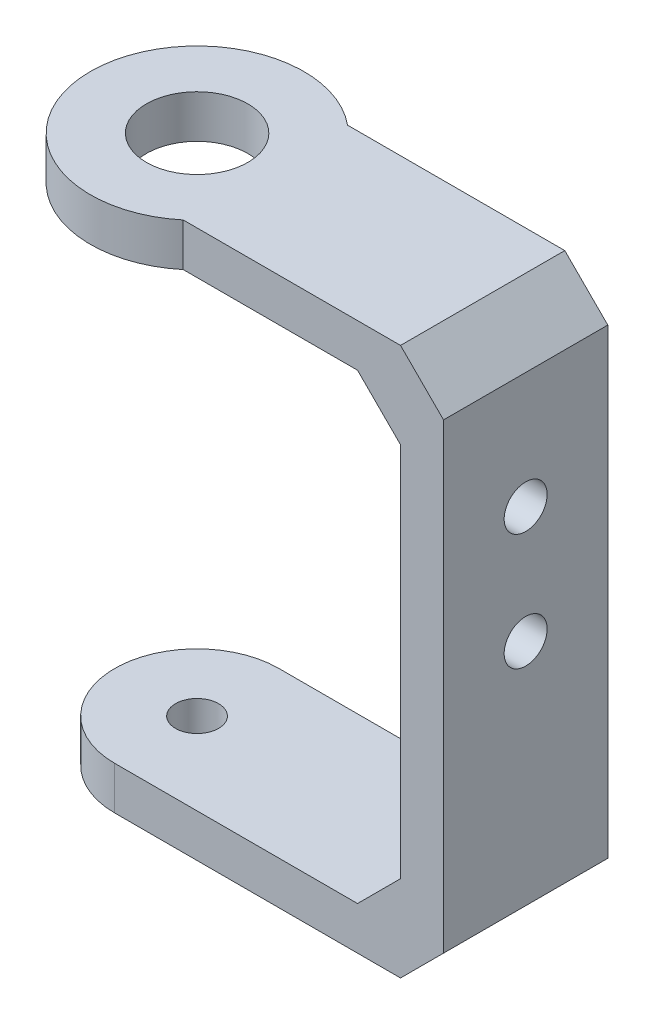
ISO-10303-21;
HEADER;
FILE_DESCRIPTION(('STEP AP214'),'2;1');
FILE_NAME('part.step','',(''),(''),'','','');
FILE_SCHEMA(('AUTOMOTIVE_DESIGN { 1 0 10303 214 1 1 1 1 }'));
ENDSEC;
DATA;
#1=APPLICATION_CONTEXT('core data for automotive mechanical design processes');
#2=APPLICATION_PROTOCOL_DEFINITION('international standard','automotive_design',2000,#1);
#3=PRODUCT_CONTEXT('',#1,'mechanical');
#4=PRODUCT('Part','Part','',(#3));
#5=PRODUCT_RELATED_PRODUCT_CATEGORY('part','',(#4));
#6=PRODUCT_DEFINITION_FORMATION('','',#4);
#7=PRODUCT_DEFINITION_CONTEXT('part definition',#1,'design');
#8=PRODUCT_DEFINITION('design','',#6,#7);
#9=PRODUCT_DEFINITION_SHAPE('','',#8);
#10=(LENGTH_UNIT() NAMED_UNIT(*) SI_UNIT(.MILLI.,.METRE.));
#11=(NAMED_UNIT(*) PLANE_ANGLE_UNIT() SI_UNIT($,.RADIAN.));
#12=(NAMED_UNIT(*) SI_UNIT($,.STERADIAN.) SOLID_ANGLE_UNIT());
#13=UNCERTAINTY_MEASURE_WITH_UNIT(LENGTH_MEASURE(1.E-05),#10,'distance_accuracy_value','');
#14=(GEOMETRIC_REPRESENTATION_CONTEXT(3) GLOBAL_UNCERTAINTY_ASSIGNED_CONTEXT((#13)) GLOBAL_UNIT_ASSIGNED_CONTEXT((#10,
#11,#12)) REPRESENTATION_CONTEXT('',''));
#15=CARTESIAN_POINT('',(0.,0.,0.));
#16=DIRECTION('',(0.,0.,1.));
#17=DIRECTION('',(1.,0.,0.));
#18=AXIS2_PLACEMENT_3D('',#15,#16,#17);
#19=CARTESIAN_POINT('',(23.7360999092236,38.9968362191147,-5.73));
#20=DIRECTION('',(0.70710700070138,0.707106561671647,0.));
#21=DIRECTION('',(-0.707106561671647,0.70710700070138,0.));
#22=AXIS2_PLACEMENT_3D('',#19,#20,#21);
#23=PLANE('',#22);
#24=DIRECTION('',(0.,0.,1.));
#25=VECTOR('',#24,1.);
#26=CARTESIAN_POINT('',(23.7360999092236,38.9968362191147,-5.73));
#27=LINE('',#26,#25);
#28=CARTESIAN_POINT('',(23.7360999092236,38.9968362191147,-5.73));
#29=VERTEX_POINT('',#28);
#30=CARTESIAN_POINT('',(23.7360999092236,38.9968362191147,5.73));
#31=VERTEX_POINT('',#30);
#32=EDGE_CURVE('E11',#29,#31,#27,.T.);
#33=ORIENTED_EDGE('',*,*,#32,.T.);
#34=DIRECTION('',(-0.707106561671647,0.70710700070138,0.));
#35=VECTOR('',#34,1.);
#36=CARTESIAN_POINT('',(23.7360999092236,38.9968362191147,5.73));
#37=LINE('',#36,#35);
#38=CARTESIAN_POINT('',(26.7361004009619,35.9968338647301,5.73));
#39=VERTEX_POINT('',#38);
#40=EDGE_CURVE('E202',#39,#31,#37,.T.);
#41=ORIENTED_EDGE('',*,*,#40,.F.);
#42=DIRECTION('',(0.,0.,1.));
#43=VECTOR('',#42,1.);
#44=CARTESIAN_POINT('',(26.7361004009619,35.9968338647301,-5.73));
#45=LINE('',#44,#43);
#46=CARTESIAN_POINT('',(26.7361004009619,35.9968338647301,-5.73));
#47=VERTEX_POINT('',#46);
#48=EDGE_CURVE('E42',#47,#39,#45,.T.);
#49=ORIENTED_EDGE('',*,*,#48,.F.);
#50=DIRECTION('',(-0.707106561671647,0.70710700070138,0.));
#51=VECTOR('',#50,1.);
#52=CARTESIAN_POINT('',(23.7360999092236,38.9968362191147,-5.73));
#53=LINE('',#52,#51);
#54=EDGE_CURVE('E49',#47,#29,#53,.T.);
#55=ORIENTED_EDGE('',*,*,#54,.T.);
#56=EDGE_LOOP('',(#33,#41,#49,#55));
#57=FACE_BOUND('',#56,.T.);
#58=ADVANCED_FACE('F33',(#57),#23,.T.);
#59=CARTESIAN_POINT('',(26.7361004009619,35.9968338647301,-5.73));
#60=DIRECTION('',(1.,0.,0.));
#61=DIRECTION('',(0.,1.,0.));
#62=AXIS2_PLACEMENT_3D('',#59,#60,#61);
#63=PLANE('',#62);
#64=CARTESIAN_POINT('',(26.7361004009619,27.8868338647301,0.));
#65=DIRECTION('',(1.,0.,0.));
#66=DIRECTION('',(0.,1.,0.));
#67=AXIS2_PLACEMENT_3D('',#64,#65,#66);
#68=CIRCLE('',#67,1.5);
#69=CARTESIAN_POINT('',(26.7361004009619,29.3868338647301,0.));
#70=VERTEX_POINT('',#69);
#71=EDGE_CURVE('E410',#70,#70,#68,.T.);
#72=ORIENTED_EDGE('',*,*,#71,.F.);
#73=EDGE_LOOP('',(#72));
#74=FACE_BOUND('',#73,.T.);
#75=CARTESIAN_POINT('',(26.7361004009619,19.7568357658201,0.));
#76=DIRECTION('',(1.,0.,0.));
#77=DIRECTION('',(0.,1.,0.));
#78=AXIS2_PLACEMENT_3D('',#75,#76,#77);
#79=CIRCLE('',#78,1.5);
#80=CARTESIAN_POINT('',(26.7361004009619,21.2568357658201,0.));
#81=VERTEX_POINT('',#80);
#82=EDGE_CURVE('E415',#81,#81,#79,.T.);
#83=ORIENTED_EDGE('',*,*,#82,.F.);
#84=EDGE_LOOP('',(#83));
#85=FACE_BOUND('',#84,.T.);
#86=ORIENTED_EDGE('',*,*,#48,.T.);
#87=DIRECTION('',(0.,1.,0.));
#88=VECTOR('',#87,1.);
#89=CARTESIAN_POINT('',(26.7361004009619,35.9968338647301,5.73));
#90=LINE('',#89,#88);
#91=CARTESIAN_POINT('',(26.7361004009619,3.77683532623596,5.73));
#92=VERTEX_POINT('',#91);
#93=EDGE_CURVE('E199',#92,#39,#90,.T.);
#94=ORIENTED_EDGE('',*,*,#93,.F.);
#95=DIRECTION('',(0.,0.,1.));
#96=VECTOR('',#95,1.);
#97=CARTESIAN_POINT('',(26.7361004009619,3.77683532623596,-5.73));
#98=LINE('',#97,#96);
#99=CARTESIAN_POINT('',(26.7361004009619,3.77683532623596,-5.73));
#100=VERTEX_POINT('',#99);
#101=EDGE_CURVE('E219',#100,#92,#98,.T.);
#102=ORIENTED_EDGE('',*,*,#101,.F.);
#103=DIRECTION('',(0.,1.,0.));
#104=VECTOR('',#103,1.);
#105=CARTESIAN_POINT('',(26.7361004009619,35.9968338647301,-5.73));
#106=LINE('',#105,#104);
#107=EDGE_CURVE('E215',#100,#47,#106,.T.);
#108=ORIENTED_EDGE('',*,*,#107,.T.);
#109=EDGE_LOOP('',(#86,#94,#102,#108));
#110=FACE_BOUND('',#109,.T.);
#111=ADVANCED_FACE('F258',(#74,#85,#110),#63,.T.);
#112=CARTESIAN_POINT('',(26.7361004009619,3.77683532623596,-5.73));
#113=DIRECTION('',(0.707106561671646,-0.707107000701381,0.));
#114=DIRECTION('',(0.707107000701381,0.707106561671646,0.));
#115=AXIS2_PLACEMENT_3D('',#112,#113,#114);
#116=PLANE('',#115);
#117=ORIENTED_EDGE('',*,*,#101,.T.);
#118=DIRECTION('',(0.707107000701381,0.707106561671646,0.));
#119=VECTOR('',#118,1.);
#120=CARTESIAN_POINT('',(26.7361004009619,3.77683532623596,5.73));
#121=LINE('',#120,#119);
#122=CARTESIAN_POINT('',(23.7360989779003,0.776835765820073,5.73));
#123=VERTEX_POINT('',#122);
#124=EDGE_CURVE('E196',#123,#92,#121,.T.);
#125=ORIENTED_EDGE('',*,*,#124,.F.);
#126=DIRECTION('',(0.,0.,1.));
#127=VECTOR('',#126,1.);
#128=CARTESIAN_POINT('',(23.7360989779003,0.776835765820073,-5.73));
#129=LINE('',#128,#127);
#130=CARTESIAN_POINT('',(23.7360989779003,0.776835765820073,-5.73));
#131=VERTEX_POINT('',#130);
#132=EDGE_CURVE('E221',#131,#123,#129,.T.);
#133=ORIENTED_EDGE('',*,*,#132,.F.);
#134=DIRECTION('',(0.707107000701381,0.707106561671646,0.));
#135=VECTOR('',#134,1.);
#136=CARTESIAN_POINT('',(26.7361004009619,3.77683532623596,-5.73));
#137=LINE('',#136,#135);
#138=EDGE_CURVE('E212',#131,#100,#137,.T.);
#139=ORIENTED_EDGE('',*,*,#138,.T.);
#140=EDGE_LOOP('',(#117,#125,#133,#139));
#141=FACE_BOUND('',#140,.T.);
#142=ADVANCED_FACE('F264',(#141),#116,.T.);
#143=CARTESIAN_POINT('',(20.7360984861625,3.77683812020412,-5.73));
#144=DIRECTION('',(-0.707106561671645,0.707107000701382,0.));
#145=DIRECTION('',(-0.707107000701382,-0.707106561671645,0.));
#146=AXIS2_PLACEMENT_3D('',#143,#144,#145);
#147=PLANE('',#146);
#148=DIRECTION('',(0.,0.,1.));
#149=VECTOR('',#148,1.);
#150=CARTESIAN_POINT('',(20.7360984861625,3.77683812020412,-5.73));
#151=LINE('',#150,#149);
#152=CARTESIAN_POINT('',(20.7360984861625,3.77683812020412,-5.73));
#153=VERTEX_POINT('',#152);
#154=CARTESIAN_POINT('',(20.7360984861625,3.77683812020412,5.73));
#155=VERTEX_POINT('',#154);
#156=EDGE_CURVE('E224',#153,#155,#151,.T.);
#157=ORIENTED_EDGE('',*,*,#156,.T.);
#158=DIRECTION('',(-0.707107000701382,-0.707106561671645,0.));
#159=VECTOR('',#158,1.);
#160=CARTESIAN_POINT('',(20.7360984861625,3.77683812020412,5.73));
#161=LINE('',#160,#159);
#162=CARTESIAN_POINT('',(23.7360989779009,6.77683674929729,5.73));
#163=VERTEX_POINT('',#162);
#164=EDGE_CURVE('E131',#163,#155,#161,.T.);
#165=ORIENTED_EDGE('',*,*,#164,.F.);
#166=DIRECTION('',(0.,0.,1.));
#167=VECTOR('',#166,1.);
#168=CARTESIAN_POINT('',(23.7360989779009,6.77683674929729,-5.73));
#169=LINE('',#168,#167);
#170=CARTESIAN_POINT('',(23.7360989779009,6.77683674929729,-5.73));
#171=VERTEX_POINT('',#170);
#172=EDGE_CURVE('E226',#171,#163,#169,.T.);
#173=ORIENTED_EDGE('',*,*,#172,.F.);
#174=DIRECTION('',(-0.707107000701382,-0.707106561671645,0.));
#175=VECTOR('',#174,1.);
#176=CARTESIAN_POINT('',(20.7360984861625,3.77683812020412,-5.73));
#177=LINE('',#176,#175);
#178=EDGE_CURVE('E210',#171,#153,#177,.T.);
#179=ORIENTED_EDGE('',*,*,#178,.T.);
#180=EDGE_LOOP('',(#157,#165,#173,#179));
#181=FACE_BOUND('',#180,.T.);
#182=ADVANCED_FACE('F255',(#181),#147,.T.);
#183=CARTESIAN_POINT('',(23.7360989779009,6.77683674929729,-5.73));
#184=DIRECTION('',(-1.,0.,0.));
#185=DIRECTION('',(0.,0.,1.));
#186=AXIS2_PLACEMENT_3D('',#183,#184,#185);
#187=PLANE('',#186);
#188=CARTESIAN_POINT('',(23.7360989779009,27.8868338647301,0.));
#189=DIRECTION('',(1.,0.,0.));
#190=DIRECTION('',(0.,1.,0.));
#191=AXIS2_PLACEMENT_3D('',#188,#189,#190);
#192=CIRCLE('',#191,1.5);
#193=CARTESIAN_POINT('',(23.7360989779009,29.3868338647301,0.));
#194=VERTEX_POINT('',#193);
#195=EDGE_CURVE('E407',#194,#194,#192,.T.);
#196=ORIENTED_EDGE('',*,*,#195,.T.);
#197=EDGE_LOOP('',(#196));
#198=FACE_BOUND('',#197,.T.);
#199=CARTESIAN_POINT('',(23.7360989779009,19.7568357658201,0.));
#200=DIRECTION('',(1.,0.,0.));
#201=DIRECTION('',(0.,1.,0.));
#202=AXIS2_PLACEMENT_3D('',#199,#200,#201);
#203=CIRCLE('',#202,1.5);
#204=CARTESIAN_POINT('',(23.7360989779009,21.2568357658201,0.));
#205=VERTEX_POINT('',#204);
#206=EDGE_CURVE('E411',#205,#205,#203,.T.);
#207=ORIENTED_EDGE('',*,*,#206,.T.);
#208=EDGE_LOOP('',(#207));
#209=FACE_BOUND('',#208,.T.);
#210=ORIENTED_EDGE('',*,*,#172,.T.);
#211=DIRECTION('',(0.,-1.,0.));
#212=VECTOR('',#211,1.);
#213=CARTESIAN_POINT('',(23.7360989779009,6.77683674929729,5.73));
#214=LINE('',#213,#212);
#215=CARTESIAN_POINT('',(23.7360989779009,32.9968380296051,5.73));
#216=VERTEX_POINT('',#215);
#217=EDGE_CURVE('E193',#216,#163,#214,.T.);
#218=ORIENTED_EDGE('',*,*,#217,.F.);
#219=DIRECTION('',(0.,0.,1.));
#220=VECTOR('',#219,1.);
#221=CARTESIAN_POINT('',(23.7360989779009,32.9968380296051,-5.73));
#222=LINE('',#221,#220);
#223=CARTESIAN_POINT('',(23.7360989779009,32.9968380296051,-5.73));
#224=VERTEX_POINT('',#223);
#225=EDGE_CURVE('E227',#224,#216,#222,.T.);
#226=ORIENTED_EDGE('',*,*,#225,.F.);
#227=DIRECTION('',(0.,-1.,0.));
#228=VECTOR('',#227,1.);
#229=CARTESIAN_POINT('',(23.7360989779009,6.77683674929729,-5.73));
#230=LINE('',#229,#228);
#231=EDGE_CURVE('E207',#224,#171,#230,.T.);
#232=ORIENTED_EDGE('',*,*,#231,.T.);
#233=EDGE_LOOP('',(#210,#218,#226,#232));
#234=FACE_BOUND('',#233,.T.);
#235=ADVANCED_FACE('F248',(#198,#209,#234),#187,.T.);
#236=CARTESIAN_POINT('',(23.7360989779009,32.9968380296051,-5.73));
#237=DIRECTION('',(-0.70710700070138,-0.707106561671647,0.));
#238=DIRECTION('',(0.707106561671647,-0.70710700070138,0.));
#239=AXIS2_PLACEMENT_3D('',#236,#237,#238);
#240=PLANE('',#239);
#241=ORIENTED_EDGE('',*,*,#225,.T.);
#242=DIRECTION('',(0.707106561671647,-0.70710700070138,0.));
#243=VECTOR('',#242,1.);
#244=CARTESIAN_POINT('',(23.7360989779009,32.9968380296051,5.73));
#245=LINE('',#244,#243);
#246=CARTESIAN_POINT('',(20.7361003488077,35.9968385213434,5.73));
#247=VERTEX_POINT('',#246);
#248=EDGE_CURVE('E188',#247,#216,#245,.T.);
#249=ORIENTED_EDGE('',*,*,#248,.F.);
#250=DIRECTION('',(0.,0.,1.));
#251=VECTOR('',#250,1.);
#252=CARTESIAN_POINT('',(20.7361003488077,35.9968385213434,-5.73));
#253=LINE('',#252,#251);
#254=CARTESIAN_POINT('',(20.7361003488077,35.9968385213434,-5.73));
#255=VERTEX_POINT('',#254);
#256=EDGE_CURVE('E37',#255,#247,#253,.T.);
#257=ORIENTED_EDGE('',*,*,#256,.F.);
#258=DIRECTION('',(0.707106561671647,-0.70710700070138,0.));
#259=VECTOR('',#258,1.);
#260=CARTESIAN_POINT('',(23.7360989779009,32.9968380296051,-5.73));
#261=LINE('',#260,#259);
#262=EDGE_CURVE('E204',#255,#224,#261,.T.);
#263=ORIENTED_EDGE('',*,*,#262,.T.);
#264=EDGE_LOOP('',(#241,#249,#257,#263));
#265=FACE_BOUND('',#264,.T.);
#266=ADVANCED_FACE('F35',(#265),#240,.T.);
#267=CARTESIAN_POINT('',(0.,0.,-5.73));
#268=DIRECTION('',(0.,0.,-1.));
#269=DIRECTION('',(-1.,0.,0.));
#270=AXIS2_PLACEMENT_3D('',#267,#268,#269);
#271=PLANE('',#270);
#272=ORIENTED_EDGE('',*,*,#262,.F.);
#273=DIRECTION('',(1.,0.,0.));
#274=VECTOR('',#273,1.);
#275=CARTESIAN_POINT('',(8.57610034880768,35.9968385213434,-5.73));
#276=LINE('',#275,#274);
#277=CARTESIAN_POINT('',(8.57610034880768,35.9968362191147,-5.73));
#278=VERTEX_POINT('',#277);
#279=EDGE_CURVE('E136',#278,#255,#276,.T.);
#280=ORIENTED_EDGE('',*,*,#279,.F.);
#281=DIRECTION('',(0.,-1.,0.));
#282=VECTOR('',#281,1.);
#283=CARTESIAN_POINT('',(8.57610034880768,38.9968362191147,-5.73));
#284=LINE('',#283,#282);
#285=CARTESIAN_POINT('',(8.57610034880768,38.9968362191147,-5.73));
#286=VERTEX_POINT('',#285);
#287=EDGE_CURVE('E173',#286,#278,#284,.T.);
#288=ORIENTED_EDGE('',*,*,#287,.F.);
#289=DIRECTION('',(-1.,0.,0.));
#290=VECTOR('',#289,1.);
#291=CARTESIAN_POINT('',(20.7361003488077,38.9968362191147,-5.73));
#292=LINE('',#291,#290);
#293=EDGE_CURVE('E170',#29,#286,#292,.T.);
#294=ORIENTED_EDGE('',*,*,#293,.F.);
#295=ORIENTED_EDGE('',*,*,#54,.F.);
#296=ORIENTED_EDGE('',*,*,#107,.F.);
#297=ORIENTED_EDGE('',*,*,#138,.F.);
#298=DIRECTION('',(1.,0.,0.));
#299=VECTOR('',#298,1.);
#300=CARTESIAN_POINT('',(8.57609848616254,0.776835765820071,-5.73));
#301=LINE('',#300,#299);
#302=CARTESIAN_POINT('',(3.79307817414659,0.776835765820073,-5.73));
#303=VERTEX_POINT('',#302);
#304=EDGE_CURVE('E186',#303,#131,#301,.T.);
#305=ORIENTED_EDGE('',*,*,#304,.F.);
#306=DIRECTION('',(0.,-1.,0.));
#307=VECTOR('',#306,1.);
#308=CARTESIAN_POINT('',(3.79307817414659,3.77683576582007,-5.73));
#309=LINE('',#308,#307);
#310=CARTESIAN_POINT('',(3.79307817414659,3.77683576582007,-5.73));
#311=VERTEX_POINT('',#310);
#312=EDGE_CURVE('E145',#311,#303,#309,.T.);
#313=ORIENTED_EDGE('',*,*,#312,.F.);
#314=DIRECTION('',(-1.,0.,0.));
#315=VECTOR('',#314,1.);
#316=CARTESIAN_POINT('',(20.7360984861625,3.77683812020412,-5.73));
#317=LINE('',#316,#315);
#318=EDGE_CURVE('E149',#153,#311,#317,.T.);
#319=ORIENTED_EDGE('',*,*,#318,.F.);
#320=ORIENTED_EDGE('',*,*,#178,.F.);
#321=ORIENTED_EDGE('',*,*,#231,.F.);
#322=EDGE_LOOP('',(#272,#280,#288,#294,#295,#296,#297,#305,#313,#319,#320,#321));
#323=FACE_BOUND('',#322,.T.);
#324=ADVANCED_FACE('F243',(#323),#271,.T.);
#325=CARTESIAN_POINT('',(0.,0.,5.73));
#326=DIRECTION('',(0.,0.,-1.));
#327=DIRECTION('',(-1.,0.,0.));
#328=AXIS2_PLACEMENT_3D('',#325,#326,#327);
#329=PLANE('',#328);
#330=ORIENTED_EDGE('',*,*,#40,.T.);
#331=DIRECTION('',(-1.,0.,0.));
#332=VECTOR('',#331,1.);
#333=CARTESIAN_POINT('',(20.7361003488077,38.9968362191147,5.73));
#334=LINE('',#333,#332);
#335=CARTESIAN_POINT('',(8.57610034880768,38.9968362191147,5.73));
#336=VERTEX_POINT('',#335);
#337=EDGE_CURVE('E168',#31,#336,#334,.T.);
#338=ORIENTED_EDGE('',*,*,#337,.T.);
#339=DIRECTION('',(0.,-1.,0.));
#340=VECTOR('',#339,1.);
#341=CARTESIAN_POINT('',(8.57610034880768,38.9968362191147,5.73));
#342=LINE('',#341,#340);
#343=CARTESIAN_POINT('',(8.57610034880768,35.9968362191147,5.73));
#344=VERTEX_POINT('',#343);
#345=EDGE_CURVE('E180',#336,#344,#342,.T.);
#346=ORIENTED_EDGE('',*,*,#345,.T.);
#347=DIRECTION('',(1.,0.,0.));
#348=VECTOR('',#347,1.);
#349=CARTESIAN_POINT('',(8.57610034880768,35.9968385213434,5.73));
#350=LINE('',#349,#348);
#351=EDGE_CURVE('E174',#344,#247,#350,.T.);
#352=ORIENTED_EDGE('',*,*,#351,.T.);
#353=ORIENTED_EDGE('',*,*,#248,.T.);
#354=ORIENTED_EDGE('',*,*,#217,.T.);
#355=ORIENTED_EDGE('',*,*,#164,.T.);
#356=DIRECTION('',(-1.,0.,0.));
#357=VECTOR('',#356,1.);
#358=CARTESIAN_POINT('',(20.7360984861625,3.77683812020412,5.73));
#359=LINE('',#358,#357);
#360=CARTESIAN_POINT('',(3.79307817414659,3.77683576582007,5.73));
#361=VERTEX_POINT('',#360);
#362=EDGE_CURVE('E122',#155,#361,#359,.T.);
#363=ORIENTED_EDGE('',*,*,#362,.T.);
#364=DIRECTION('',(0.,-1.,0.));
#365=VECTOR('',#364,1.);
#366=CARTESIAN_POINT('',(3.79307817414659,3.77683576582007,5.73));
#367=LINE('',#366,#365);
#368=CARTESIAN_POINT('',(3.79307817414659,0.776835765820073,5.73));
#369=VERTEX_POINT('',#368);
#370=EDGE_CURVE('E127',#361,#369,#367,.T.);
#371=ORIENTED_EDGE('',*,*,#370,.T.);
#372=DIRECTION('',(-1.,0.,0.));
#373=VECTOR('',#372,1.);
#374=CARTESIAN_POINT('',(23.7360989779003,0.776835765820073,5.73));
#375=LINE('',#374,#373);
#376=EDGE_CURVE('E135',#123,#369,#375,.T.);
#377=ORIENTED_EDGE('',*,*,#376,.F.);
#378=ORIENTED_EDGE('',*,*,#124,.T.);
#379=ORIENTED_EDGE('',*,*,#93,.T.);
#380=EDGE_LOOP('',(#330,#338,#346,#352,#353,#354,#355,#363,#371,#377,#378,#379));
#381=FACE_BOUND('',#380,.T.);
#382=ADVANCED_FACE('F125',(#381),#329,.F.);
#383=CARTESIAN_POINT('',(23.7360989779003,0.776835765820073,-5.73));
#384=DIRECTION('',(0.,1.,0.));
#385=DIRECTION('',(0.,0.,1.));
#386=AXIS2_PLACEMENT_3D('',#383,#384,#385);
#387=PLANE('',#386);
#388=CARTESIAN_POINT('',(3.81,0.776838120204118,0.));
#389=DIRECTION('',(0.,1.,0.));
#390=DIRECTION('',(-1.,0.,0.));
#391=AXIS2_PLACEMENT_3D('',#388,#389,#390);
#392=CIRCLE('',#391,1.5);
#393=CARTESIAN_POINT('',(2.31,0.776838120204118,0.));
#394=VERTEX_POINT('',#393);
#395=EDGE_CURVE('E152',#394,#394,#392,.T.);
#396=ORIENTED_EDGE('',*,*,#395,.T.);
#397=EDGE_LOOP('',(#396));
#398=FACE_BOUND('',#397,.T.);
#399=ORIENTED_EDGE('',*,*,#376,.T.);
#400=CARTESIAN_POINT('',(3.79307817414659,0.776835765820073,0.));
#401=DIRECTION('',(0.,-1.,0.));
#402=DIRECTION('',(0.,0.,-1.));
#403=AXIS2_PLACEMENT_3D('',#400,#401,#402);
#404=CIRCLE('',#403,5.73);
#405=EDGE_CURVE('E144',#369,#303,#404,.T.);
#406=ORIENTED_EDGE('',*,*,#405,.T.);
#407=ORIENTED_EDGE('',*,*,#304,.T.);
#408=ORIENTED_EDGE('',*,*,#132,.T.);
#409=EDGE_LOOP('',(#399,#406,#407,#408));
#410=FACE_BOUND('',#409,.T.);
#411=ADVANCED_FACE('F277',(#398,#410),#387,.F.);
#412=CARTESIAN_POINT('',(20.7360984861625,3.77683812020412,-5.73));
#413=DIRECTION('',(0.,1.,0.));
#414=DIRECTION('',(-1.,0.,0.));
#415=AXIS2_PLACEMENT_3D('',#412,#413,#414);
#416=PLANE('',#415);
#417=CARTESIAN_POINT('',(3.81,3.77683812020412,0.));
#418=DIRECTION('',(0.,1.,0.));
#419=DIRECTION('',(-1.,0.,0.));
#420=AXIS2_PLACEMENT_3D('',#417,#418,#419);
#421=CIRCLE('',#420,1.5);
#422=CARTESIAN_POINT('',(2.31,3.77683812020412,0.));
#423=VERTEX_POINT('',#422);
#424=EDGE_CURVE('E155',#423,#423,#421,.T.);
#425=ORIENTED_EDGE('',*,*,#424,.F.);
#426=EDGE_LOOP('',(#425));
#427=FACE_BOUND('',#426,.T.);
#428=ORIENTED_EDGE('',*,*,#362,.F.);
#429=ORIENTED_EDGE('',*,*,#156,.F.);
#430=ORIENTED_EDGE('',*,*,#318,.T.);
#431=CARTESIAN_POINT('',(3.79307817414659,3.77683576582007,0.));
#432=DIRECTION('',(0.,-1.,0.));
#433=DIRECTION('',(0.,0.,-1.));
#434=AXIS2_PLACEMENT_3D('',#431,#432,#433);
#435=CIRCLE('',#434,5.73);
#436=EDGE_CURVE('E142',#361,#311,#435,.T.);
#437=ORIENTED_EDGE('',*,*,#436,.F.);
#438=EDGE_LOOP('',(#428,#429,#430,#437));
#439=FACE_BOUND('',#438,.T.);
#440=ADVANCED_FACE('F147',(#427,#439),#416,.T.);
#441=CARTESIAN_POINT('',(8.57610034880768,35.9968385213434,-5.73));
#442=DIRECTION('',(0.,-1.,0.));
#443=DIRECTION('',(0.,0.,-1.));
#444=AXIS2_PLACEMENT_3D('',#441,#442,#443);
#445=PLANE('',#444);
#446=CARTESIAN_POINT('',(3.81484001146002,35.9968362191147,0.));
#447=DIRECTION('',(0.,1.,0.));
#448=DIRECTION('',(0.,0.,1.));
#449=AXIS2_PLACEMENT_3D('',#446,#447,#448);
#450=CIRCLE('',#449,3.54);
#451=CARTESIAN_POINT('',(3.81484001146002,35.9968362191147,3.54));
#452=VERTEX_POINT('',#451);
#453=EDGE_CURVE('E160',#452,#452,#450,.T.);
#454=ORIENTED_EDGE('',*,*,#453,.T.);
#455=EDGE_LOOP('',(#454));
#456=FACE_BOUND('',#455,.T.);
#457=ORIENTED_EDGE('',*,*,#351,.F.);
#458=CARTESIAN_POINT('',(3.81484001146002,35.9968362191147,0.));
#459=DIRECTION('',(0.,1.,0.));
#460=DIRECTION('',(0.,0.,1.));
#461=AXIS2_PLACEMENT_3D('',#458,#459,#460);
#462=CIRCLE('',#461,7.45);
#463=EDGE_CURVE('E166',#278,#344,#462,.T.);
#464=ORIENTED_EDGE('',*,*,#463,.F.);
#465=ORIENTED_EDGE('',*,*,#279,.T.);
#466=ORIENTED_EDGE('',*,*,#256,.T.);
#467=EDGE_LOOP('',(#457,#464,#465,#466));
#468=FACE_BOUND('',#467,.T.);
#469=ADVANCED_FACE('F233',(#456,#468),#445,.T.);
#470=CARTESIAN_POINT('',(20.7361003488077,38.9968362191147,-5.73));
#471=DIRECTION('',(0.,1.,0.));
#472=DIRECTION('',(0.,0.,1.));
#473=AXIS2_PLACEMENT_3D('',#470,#471,#472);
#474=PLANE('',#473);
#475=CARTESIAN_POINT('',(3.81484001146002,38.9968362191147,0.));
#476=DIRECTION('',(0.,1.,0.));
#477=DIRECTION('',(0.,0.,1.));
#478=AXIS2_PLACEMENT_3D('',#475,#476,#477);
#479=CIRCLE('',#478,3.54);
#480=CARTESIAN_POINT('',(3.81484001146002,38.9968362191147,3.54));
#481=VERTEX_POINT('',#480);
#482=EDGE_CURVE('E158',#481,#481,#479,.T.);
#483=ORIENTED_EDGE('',*,*,#482,.F.);
#484=EDGE_LOOP('',(#483));
#485=FACE_BOUND('',#484,.T.);
#486=ORIENTED_EDGE('',*,*,#337,.F.);
#487=ORIENTED_EDGE('',*,*,#32,.F.);
#488=ORIENTED_EDGE('',*,*,#293,.T.);
#489=CARTESIAN_POINT('',(3.81484001146002,38.9968362191147,0.));
#490=DIRECTION('',(0.,1.,0.));
#491=DIRECTION('',(0.,0.,1.));
#492=AXIS2_PLACEMENT_3D('',#489,#490,#491);
#493=CIRCLE('',#492,7.45);
#494=EDGE_CURVE('E163',#286,#336,#493,.T.);
#495=ORIENTED_EDGE('',*,*,#494,.T.);
#496=EDGE_LOOP('',(#486,#487,#488,#495));
#497=FACE_BOUND('',#496,.T.);
#498=ADVANCED_FACE('F283',(#485,#497),#474,.T.);
#499=CARTESIAN_POINT('',(3.81484001146002,35.9968362191147,0.));
#500=DIRECTION('',(0.,1.,0.));
#501=DIRECTION('',(0.,0.,1.));
#502=AXIS2_PLACEMENT_3D('',#499,#500,#501);
#503=CYLINDRICAL_SURFACE('',#502,7.45);
#504=ORIENTED_EDGE('',*,*,#494,.F.);
#505=ORIENTED_EDGE('',*,*,#287,.T.);
#506=ORIENTED_EDGE('',*,*,#463,.T.);
#507=ORIENTED_EDGE('',*,*,#345,.F.);
#508=EDGE_LOOP('',(#504,#505,#506,#507));
#509=FACE_BOUND('',#508,.T.);
#510=ADVANCED_FACE('F240',(#509),#503,.T.);
#511=CARTESIAN_POINT('',(3.81484001146002,35.9968362191147,0.));
#512=DIRECTION('',(0.,1.,0.));
#513=DIRECTION('',(0.,0.,1.));
#514=AXIS2_PLACEMENT_3D('',#511,#512,#513);
#515=CYLINDRICAL_SURFACE('',#514,3.54);
#516=ORIENTED_EDGE('',*,*,#453,.F.);
#517=EDGE_LOOP('',(#516));
#518=FACE_BOUND('',#517,.T.);
#519=ORIENTED_EDGE('',*,*,#482,.T.);
#520=EDGE_LOOP('',(#519));
#521=FACE_BOUND('',#520,.T.);
#522=ADVANCED_FACE('F291',(#518,#521),#515,.F.);
#523=CARTESIAN_POINT('',(3.79307817414659,3.77683576582007,0.));
#524=DIRECTION('',(0.,-1.,0.));
#525=DIRECTION('',(0.,0.,-1.));
#526=AXIS2_PLACEMENT_3D('',#523,#524,#525);
#527=CYLINDRICAL_SURFACE('',#526,5.73);
#528=ORIENTED_EDGE('',*,*,#405,.F.);
#529=ORIENTED_EDGE('',*,*,#370,.F.);
#530=ORIENTED_EDGE('',*,*,#436,.T.);
#531=ORIENTED_EDGE('',*,*,#312,.T.);
#532=EDGE_LOOP('',(#528,#529,#530,#531));
#533=FACE_BOUND('',#532,.T.);
#534=ADVANCED_FACE('F140',(#533),#527,.T.);
#535=CARTESIAN_POINT('',(3.81,0.776838120204118,0.));
#536=DIRECTION('',(0.,1.,0.));
#537=DIRECTION('',(-1.,0.,0.));
#538=AXIS2_PLACEMENT_3D('',#535,#536,#537);
#539=CYLINDRICAL_SURFACE('',#538,1.5);
#540=ORIENTED_EDGE('',*,*,#395,.F.);
#541=EDGE_LOOP('',(#540));
#542=FACE_BOUND('',#541,.T.);
#543=ORIENTED_EDGE('',*,*,#424,.T.);
#544=EDGE_LOOP('',(#543));
#545=FACE_BOUND('',#544,.T.);
#546=ADVANCED_FACE('F373',(#542,#545),#539,.F.);
#547=CARTESIAN_POINT('',(23.7360989779009,19.7568357658201,0.));
#548=DIRECTION('',(1.,0.,0.));
#549=DIRECTION('',(0.,1.,0.));
#550=AXIS2_PLACEMENT_3D('',#547,#548,#549);
#551=CYLINDRICAL_SURFACE('',#550,1.5);
#552=CARTESIAN_POINT('',(23.7360989779009,21.2568357658201,0.));
#553=CARTESIAN_POINT('',(23.7673489927244,21.2568357658201,0.));
#554=CARTESIAN_POINT('',(23.798599007548,21.2568357658201,0.));
#555=CARTESIAN_POINT('',(23.8610990371951,21.2568357658201,0.));
#556=CARTESIAN_POINT('',(23.8923490520186,21.2568357658201,0.));
#557=CARTESIAN_POINT('',(23.9548490816657,21.2568357658201,0.));
#558=CARTESIAN_POINT('',(23.9860990964893,21.2568357658201,0.));
#559=CARTESIAN_POINT('',(24.0485991261364,21.2568357658201,0.));
#560=CARTESIAN_POINT('',(24.0798491409599,21.2568357658201,0.));
#561=CARTESIAN_POINT('',(24.142349170607,21.2568357658201,0.));
#562=CARTESIAN_POINT('',(24.1735991854306,21.2568357658201,0.));
#563=CARTESIAN_POINT('',(24.2360992150777,21.2568357658201,0.));
#564=CARTESIAN_POINT('',(24.2673492299013,21.2568357658201,0.));
#565=CARTESIAN_POINT('',(24.3298492595484,21.2568357658201,0.));
#566=CARTESIAN_POINT('',(24.3610992743719,21.2568357658201,0.));
#567=CARTESIAN_POINT('',(24.423599304019,21.2568357658201,0.));
#568=CARTESIAN_POINT('',(24.4548493188426,21.2568357658201,0.));
#569=CARTESIAN_POINT('',(24.5173493484897,21.2568357658201,0.));
#570=CARTESIAN_POINT('',(24.5485993633132,21.2568357658201,0.));
#571=CARTESIAN_POINT('',(24.6110993929603,21.2568357658201,0.));
#572=CARTESIAN_POINT('',(24.6423494077839,21.2568357658201,0.));
#573=CARTESIAN_POINT('',(24.704849437431,21.2568357658201,0.));
#574=CARTESIAN_POINT('',(24.7360994522545,21.2568357658201,0.));
#575=CARTESIAN_POINT('',(24.7985994819016,21.2568357658201,0.));
#576=CARTESIAN_POINT('',(24.8298494967252,21.2568357658201,0.));
#577=CARTESIAN_POINT('',(24.8923495263723,21.2568357658201,0.));
#578=CARTESIAN_POINT('',(24.9235995411959,21.2568357658201,0.));
#579=CARTESIAN_POINT('',(24.986099570843,21.2568357658201,0.));
#580=CARTESIAN_POINT('',(25.0173495856665,21.2568357658201,0.));
#581=CARTESIAN_POINT('',(25.0798496153136,21.2568357658201,0.));
#582=CARTESIAN_POINT('',(25.1110996301372,21.2568357658201,0.));
#583=CARTESIAN_POINT('',(25.1735996597843,21.2568357658201,0.));
#584=CARTESIAN_POINT('',(25.2048496746078,21.2568357658201,0.));
#585=CARTESIAN_POINT('',(25.2673497042549,21.2568357658201,0.));
#586=CARTESIAN_POINT('',(25.2985997190785,21.2568357658201,0.));
#587=CARTESIAN_POINT('',(25.3610997487256,21.2568357658201,0.));
#588=CARTESIAN_POINT('',(25.3923497635491,21.2568357658201,0.));
#589=CARTESIAN_POINT('',(25.4548497931962,21.2568357658201,0.));
#590=CARTESIAN_POINT('',(25.4860998080198,21.2568357658201,0.));
#591=CARTESIAN_POINT('',(25.5485998376669,21.2568357658201,0.));
#592=CARTESIAN_POINT('',(25.5798498524905,21.2568357658201,0.));
#593=CARTESIAN_POINT('',(25.6423498821376,21.2568357658201,0.));
#594=CARTESIAN_POINT('',(25.6735998969611,21.2568357658201,0.));
#595=CARTESIAN_POINT('',(25.7360999266082,21.2568357658201,0.));
#596=CARTESIAN_POINT('',(25.7673499414318,21.2568357658201,0.));
#597=CARTESIAN_POINT('',(25.8298499710789,21.2568357658201,0.));
#598=CARTESIAN_POINT('',(25.8610999859024,21.2568357658201,0.));
#599=CARTESIAN_POINT('',(25.9236000155495,21.2568357658201,0.));
#600=CARTESIAN_POINT('',(25.9548500303731,21.2568357658201,0.));
#601=CARTESIAN_POINT('',(26.0173500600202,21.2568357658201,0.));
#602=CARTESIAN_POINT('',(26.0486000748437,21.2568357658201,0.));
#603=CARTESIAN_POINT('',(26.1111001044908,21.2568357658201,0.));
#604=CARTESIAN_POINT('',(26.1423501193144,21.2568357658201,0.));
#605=CARTESIAN_POINT('',(26.2048501489615,21.2568357658201,0.));
#606=CARTESIAN_POINT('',(26.2361001637851,21.2568357658201,0.));
#607=CARTESIAN_POINT('',(26.2986001934322,21.2568357658201,0.));
#608=CARTESIAN_POINT('',(26.3298502082557,21.2568357658201,0.));
#609=CARTESIAN_POINT('',(26.3923502379028,21.2568357658201,0.));
#610=CARTESIAN_POINT('',(26.4236002527264,21.2568357658201,0.));
#611=CARTESIAN_POINT('',(26.4861002823735,21.2568357658201,0.));
#612=CARTESIAN_POINT('',(26.517350297197,21.2568357658201,0.));
#613=CARTESIAN_POINT('',(26.5798503268441,21.2568357658201,0.));
#614=CARTESIAN_POINT('',(26.6111003416677,21.2568357658201,0.));
#615=CARTESIAN_POINT('',(26.6736003713148,21.2568357658201,0.));
#616=CARTESIAN_POINT('',(26.7048503861383,21.2568357658201,0.));
#617=CARTESIAN_POINT('',(26.7361004009619,21.2568357658201,0.));
#618=B_SPLINE_CURVE_WITH_KNOTS('',3,(#552,#553,#554,#555,#556,#557,#558,#559,#560,#561,#562,
#563,#564,#565,#566,#567,#568,#569,#570,#571,#572,#573,#574,#575,#576,#577,#578,#579,#580,#581,
#582,#583,#584,#585,#586,#587,#588,#589,#590,#591,#592,#593,#594,#595,#596,#597,#598,#599,#600,
#601,#602,#603,#604,#605,#606,#607,#608,#609,#610,#611,#612,#613,#614,#615,#616,#617),
.UNSPECIFIED.,.F.,.F.,(4,2,2,2,2,2,2,2,2,2,2,2,2,2,2,2,2,2,2,2,2,2,2,2,2,2,2,2,2,2,2,2,4),(0.,
0.0937500444706564,0.187500088941313,0.281250133411969,0.375000177882626,0.468750222353286,
0.562500266823942,0.656250311294598,0.750000355765255,0.843750400235915,0.937500444706571,
1.03125048917723,1.12500053364788,1.21875057811854,1.3125006225892,1.40625066705986,
1.50000071153051,1.59375075600117,1.68750080047183,1.78125084494249,1.87500088941314,
1.9687509338838,2.06250097835446,2.15625102282511,2.25000106729577,2.34375111176643,
2.43750115623709,2.53125120070774,2.6250012451784,2.71875128964906,2.81250133411972,
2.90625137859037,3.00000142306103),.UNSPECIFIED.);
#619=EDGE_CURVE('BSEAM380',#205,#81,#618,.T.);
#620=ORIENTED_EDGE('',*,*,#206,.F.);
#621=ORIENTED_EDGE('',*,*,#82,.T.);
#622=ORIENTED_EDGE('',*,*,#619,.T.);
#623=ORIENTED_EDGE('',*,*,#619,.F.);
#624=EDGE_LOOP('',(#620,#622,#621,#623));
#625=FACE_BOUND('',#624,.T.);
#626=ADVANCED_FACE('F380',(#625),#551,.F.);
#627=CARTESIAN_POINT('',(23.7360989779009,27.8868338647301,0.));
#628=DIRECTION('',(1.,0.,0.));
#629=DIRECTION('',(0.,1.,0.));
#630=AXIS2_PLACEMENT_3D('',#627,#628,#629);
#631=CYLINDRICAL_SURFACE('',#630,1.5);
#632=CARTESIAN_POINT('',(23.7360989779009,29.3868338647301,0.));
#633=CARTESIAN_POINT('',(23.7673489927244,29.3868338647301,0.));
#634=CARTESIAN_POINT('',(23.798599007548,29.3868338647301,0.));
#635=CARTESIAN_POINT('',(23.8610990371951,29.3868338647301,0.));
#636=CARTESIAN_POINT('',(23.8923490520186,29.3868338647301,0.));
#637=CARTESIAN_POINT('',(23.9548490816657,29.3868338647301,0.));
#638=CARTESIAN_POINT('',(23.9860990964893,29.3868338647301,0.));
#639=CARTESIAN_POINT('',(24.0485991261364,29.3868338647301,0.));
#640=CARTESIAN_POINT('',(24.0798491409599,29.3868338647301,0.));
#641=CARTESIAN_POINT('',(24.142349170607,29.3868338647301,0.));
#642=CARTESIAN_POINT('',(24.1735991854306,29.3868338647301,0.));
#643=CARTESIAN_POINT('',(24.2360992150777,29.3868338647301,0.));
#644=CARTESIAN_POINT('',(24.2673492299012,29.3868338647301,0.));
#645=CARTESIAN_POINT('',(24.3298492595484,29.3868338647301,0.));
#646=CARTESIAN_POINT('',(24.3610992743719,29.3868338647301,0.));
#647=CARTESIAN_POINT('',(24.423599304019,29.3868338647301,0.));
#648=CARTESIAN_POINT('',(24.4548493188426,29.3868338647301,0.));
#649=CARTESIAN_POINT('',(24.5173493484897,29.3868338647301,0.));
#650=CARTESIAN_POINT('',(24.5485993633132,29.3868338647301,0.));
#651=CARTESIAN_POINT('',(24.6110993929603,29.3868338647301,0.));
#652=CARTESIAN_POINT('',(24.6423494077839,29.3868338647301,0.));
#653=CARTESIAN_POINT('',(24.704849437431,29.3868338647301,0.));
#654=CARTESIAN_POINT('',(24.7360994522545,29.3868338647301,0.));
#655=CARTESIAN_POINT('',(24.7985994819016,29.3868338647301,0.));
#656=CARTESIAN_POINT('',(24.8298494967252,29.3868338647301,0.));
#657=CARTESIAN_POINT('',(24.8923495263723,29.3868338647301,0.));
#658=CARTESIAN_POINT('',(24.9235995411958,29.3868338647301,0.));
#659=CARTESIAN_POINT('',(24.986099570843,29.3868338647301,0.));
#660=CARTESIAN_POINT('',(25.0173495856665,29.3868338647301,0.));
#661=CARTESIAN_POINT('',(25.0798496153136,29.3868338647301,0.));
#662=CARTESIAN_POINT('',(25.1110996301372,29.3868338647301,0.));
#663=CARTESIAN_POINT('',(25.1735996597843,29.3868338647301,0.));
#664=CARTESIAN_POINT('',(25.2048496746078,29.3868338647301,0.));
#665=CARTESIAN_POINT('',(25.2673497042549,29.3868338647301,0.));
#666=CARTESIAN_POINT('',(25.2985997190785,29.3868338647301,0.));
#667=CARTESIAN_POINT('',(25.3610997487256,29.3868338647301,0.));
#668=CARTESIAN_POINT('',(25.3923497635491,29.3868338647301,0.));
#669=CARTESIAN_POINT('',(25.4548497931962,29.3868338647301,0.));
#670=CARTESIAN_POINT('',(25.4860998080198,29.3868338647301,0.));
#671=CARTESIAN_POINT('',(25.5485998376669,29.3868338647301,0.));
#672=CARTESIAN_POINT('',(25.5798498524905,29.3868338647301,0.));
#673=CARTESIAN_POINT('',(25.6423498821376,29.3868338647301,0.));
#674=CARTESIAN_POINT('',(25.6735998969611,29.3868338647301,0.));
#675=CARTESIAN_POINT('',(25.7360999266082,29.3868338647301,0.));
#676=CARTESIAN_POINT('',(25.7673499414318,29.3868338647301,0.));
#677=CARTESIAN_POINT('',(25.8298499710789,29.3868338647301,0.));
#678=CARTESIAN_POINT('',(25.8610999859024,29.3868338647301,0.));
#679=CARTESIAN_POINT('',(25.9236000155495,29.3868338647301,0.));
#680=CARTESIAN_POINT('',(25.9548500303731,29.3868338647301,0.));
#681=CARTESIAN_POINT('',(26.0173500600202,29.3868338647301,0.));
#682=CARTESIAN_POINT('',(26.0486000748437,29.3868338647301,0.));
#683=CARTESIAN_POINT('',(26.1111001044908,29.3868338647301,0.));
#684=CARTESIAN_POINT('',(26.1423501193144,29.3868338647301,0.));
#685=CARTESIAN_POINT('',(26.2048501489615,29.3868338647301,0.));
#686=CARTESIAN_POINT('',(26.236100163785,29.3868338647301,0.));
#687=CARTESIAN_POINT('',(26.2986001934322,29.3868338647301,0.));
#688=CARTESIAN_POINT('',(26.3298502082557,29.3868338647301,0.));
#689=CARTESIAN_POINT('',(26.3923502379028,29.3868338647301,0.));
#690=CARTESIAN_POINT('',(26.4236002527264,29.3868338647301,0.));
#691=CARTESIAN_POINT('',(26.4861002823735,29.3868338647301,0.));
#692=CARTESIAN_POINT('',(26.517350297197,29.3868338647301,0.));
#693=CARTESIAN_POINT('',(26.5798503268441,29.3868338647301,0.));
#694=CARTESIAN_POINT('',(26.6111003416677,29.3868338647301,0.));
#695=CARTESIAN_POINT('',(26.6736003713148,29.3868338647301,0.));
#696=CARTESIAN_POINT('',(26.7048503861383,29.3868338647301,0.));
#697=CARTESIAN_POINT('',(26.7361004009619,29.3868338647301,0.));
#698=B_SPLINE_CURVE_WITH_KNOTS('',3,(#632,#633,#634,#635,#636,#637,#638,#639,#640,#641,#642,
#643,#644,#645,#646,#647,#648,#649,#650,#651,#652,#653,#654,#655,#656,#657,#658,#659,#660,#661,
#662,#663,#664,#665,#666,#667,#668,#669,#670,#671,#672,#673,#674,#675,#676,#677,#678,#679,#680,
#681,#682,#683,#684,#685,#686,#687,#688,#689,#690,#691,#692,#693,#694,#695,#696,#697),
.UNSPECIFIED.,.F.,.F.,(4,2,2,2,2,2,2,2,2,2,2,2,2,2,2,2,2,2,2,2,2,2,2,2,2,2,2,2,2,2,2,2,4),(0.,
0.0937500444706564,0.187500088941313,0.281250133411969,0.375000177882629,0.468750222353286,
0.562500266823942,0.656250311294598,0.750000355765258,0.843750400235915,0.937500444706571,
1.03125048917723,1.12500053364789,1.21875057811854,1.3125006225892,1.40625066705986,
1.50000071153052,1.59375075600117,1.68750080047183,1.78125084494249,1.87500088941315,
1.9687509338838,2.06250097835446,2.15625102282511,2.25000106729577,2.34375111176643,
2.43750115623709,2.53125120070774,2.6250012451784,2.71875128964906,2.81250133411972,
2.90625137859037,3.00000142306103),.UNSPECIFIED.);
#699=EDGE_CURVE('BSEAM389',#194,#70,#698,.T.);
#700=ORIENTED_EDGE('',*,*,#195,.F.);
#701=ORIENTED_EDGE('',*,*,#71,.T.);
#702=ORIENTED_EDGE('',*,*,#699,.T.);
#703=ORIENTED_EDGE('',*,*,#699,.F.);
#704=EDGE_LOOP('',(#700,#702,#701,#703));
#705=FACE_BOUND('',#704,.T.);
#706=ADVANCED_FACE('F389',(#705),#631,.F.);
#707=CLOSED_SHELL('',(#58,#111,#142,#182,#235,#266,#324,#382,#411,#440,#469,#498,#510,#522,#534,
#546,#626,#706));
#708=MANIFOLD_SOLID_BREP('B2',#707);
#709=ADVANCED_BREP_SHAPE_REPRESENTATION('',(#18,#708),#14);
#710=SHAPE_DEFINITION_REPRESENTATION(#9,#709);
ENDSEC;
END-ISO-10303-21;
